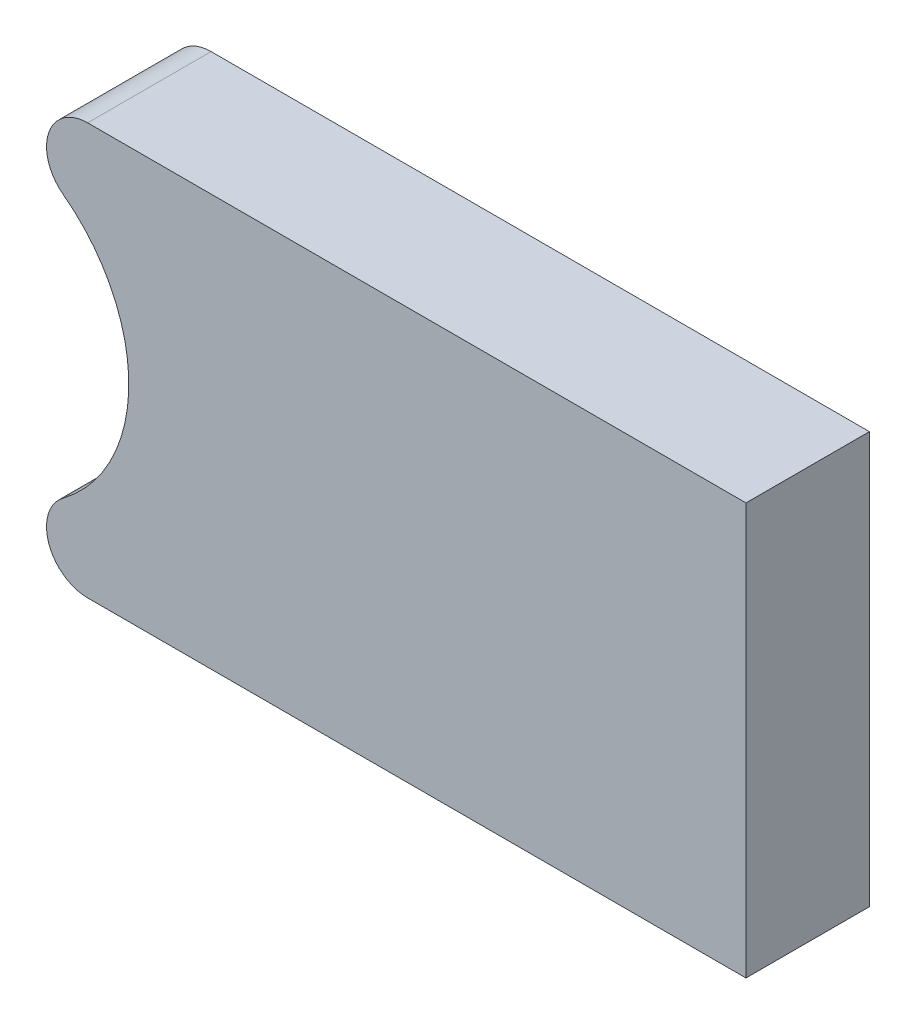
ISO-10303-21;
HEADER;
FILE_DESCRIPTION(('STEP AP214'),'2;1');
FILE_NAME('part.step','',(''),(''),'','','');
FILE_SCHEMA(('AUTOMOTIVE_DESIGN { 1 0 10303 214 1 1 1 1 }'));
ENDSEC;
DATA;
#1=APPLICATION_CONTEXT('core data for automotive mechanical design processes');
#2=APPLICATION_PROTOCOL_DEFINITION('international standard','automotive_design',2000,#1);
#3=PRODUCT_CONTEXT('',#1,'mechanical');
#4=PRODUCT('Part','Part','',(#3));
#5=PRODUCT_RELATED_PRODUCT_CATEGORY('part','',(#4));
#6=PRODUCT_DEFINITION_FORMATION('','',#4);
#7=PRODUCT_DEFINITION_CONTEXT('part definition',#1,'design');
#8=PRODUCT_DEFINITION('design','',#6,#7);
#9=PRODUCT_DEFINITION_SHAPE('','',#8);
#10=(LENGTH_UNIT() NAMED_UNIT(*) SI_UNIT(.MILLI.,.METRE.));
#11=(NAMED_UNIT(*) PLANE_ANGLE_UNIT() SI_UNIT($,.RADIAN.));
#12=(NAMED_UNIT(*) SI_UNIT($,.STERADIAN.) SOLID_ANGLE_UNIT());
#13=UNCERTAINTY_MEASURE_WITH_UNIT(LENGTH_MEASURE(1.E-05),#10,'distance_accuracy_value','');
#14=(GEOMETRIC_REPRESENTATION_CONTEXT(3) GLOBAL_UNCERTAINTY_ASSIGNED_CONTEXT((#13)) GLOBAL_UNIT_ASSIGNED_CONTEXT((#10,
#11,#12)) REPRESENTATION_CONTEXT('',''));
#15=CARTESIAN_POINT('',(0.,0.,0.));
#16=DIRECTION('',(0.,0.,1.));
#17=DIRECTION('',(1.,0.,0.));
#18=AXIS2_PLACEMENT_3D('',#15,#16,#17);
#19=CARTESIAN_POINT('',(0.,0.,0.));
#20=DIRECTION('',(0.,0.,1.));
#21=DIRECTION('',(1.,0.,0.));
#22=AXIS2_PLACEMENT_3D('',#19,#20,#21);
#23=PLANE('',#22);
#24=DIRECTION('',(0.,-1.,0.));
#25=VECTOR('',#24,1.);
#26=CARTESIAN_POINT('',(-60.325,19.05,0.));
#27=LINE('',#26,#25);
#28=CARTESIAN_POINT('',(-60.325,15.875,0.));
#29=VERTEX_POINT('',#28);
#30=CARTESIAN_POINT('',(-60.325,-15.875,0.));
#31=VERTEX_POINT('',#30);
#32=EDGE_CURVE('E129',#29,#31,#27,.T.);
#33=ORIENTED_EDGE('',*,*,#32,.F.);
#34=DIRECTION('',(-1.,0.,0.));
#35=VECTOR('',#34,1.);
#36=CARTESIAN_POINT('',(-111.125,15.875,0.));
#37=LINE('',#36,#35);
#38=CARTESIAN_POINT('',(-111.125,15.875,0.));
#39=VERTEX_POINT('',#38);
#40=EDGE_CURVE('E104',#29,#39,#37,.T.);
#41=ORIENTED_EDGE('',*,*,#40,.T.);
#42=CARTESIAN_POINT('',(-111.125,12.7,0.));
#43=DIRECTION('',(0.,0.,1.));
#44=DIRECTION('',(0.,-1.,0.));
#45=AXIS2_PLACEMENT_3D('',#42,#43,#44);
#46=CIRCLE('',#45,3.175);
#47=CARTESIAN_POINT('',(-113.03,10.16,0.));
#48=VERTEX_POINT('',#47);
#49=EDGE_CURVE('E113',#39,#48,#46,.T.);
#50=ORIENTED_EDGE('',*,*,#49,.T.);
#51=CARTESIAN_POINT('',(-120.65,0.,0.));
#52=DIRECTION('',(0.,0.,-1.));
#53=DIRECTION('',(0.,1.,0.));
#54=AXIS2_PLACEMENT_3D('',#51,#52,#53);
#55=CIRCLE('',#54,12.7);
#56=CARTESIAN_POINT('',(-113.03,-10.16,0.));
#57=VERTEX_POINT('',#56);
#58=EDGE_CURVE('E91',#48,#57,#55,.T.);
#59=ORIENTED_EDGE('',*,*,#58,.T.);
#60=CARTESIAN_POINT('',(-111.125,-12.7,0.));
#61=DIRECTION('',(0.,0.,1.));
#62=DIRECTION('',(0.,1.,0.));
#63=AXIS2_PLACEMENT_3D('',#60,#61,#62);
#64=CIRCLE('',#63,3.175);
#65=CARTESIAN_POINT('',(-111.125,-15.875,0.));
#66=VERTEX_POINT('',#65);
#67=EDGE_CURVE('E116',#57,#66,#64,.T.);
#68=ORIENTED_EDGE('',*,*,#67,.T.);
#69=DIRECTION('',(1.,0.,0.));
#70=VECTOR('',#69,1.);
#71=CARTESIAN_POINT('',(-9.52499999999993,-15.875,0.));
#72=LINE('',#71,#70);
#73=EDGE_CURVE('E119',#66,#31,#72,.T.);
#74=ORIENTED_EDGE('',*,*,#73,.T.);
#75=EDGE_LOOP('',(#33,#41,#50,#59,#68,#74));
#76=FACE_BOUND('',#75,.T.);
#77=ADVANCED_FACE('F33',(#76),#23,.T.);
#78=CARTESIAN_POINT('',(-60.325,19.05,-81.3322294290173));
#79=DIRECTION('',(-1.,0.,0.));
#80=DIRECTION('',(0.,-1.,0.));
#81=AXIS2_PLACEMENT_3D('',#78,#79,#80);
#82=PLANE('',#81);
#83=DIRECTION('',(0.,0.,-1.));
#84=VECTOR('',#83,1.);
#85=CARTESIAN_POINT('',(-60.325,15.875,-81.3322294290173));
#86=LINE('',#85,#84);
#87=CARTESIAN_POINT('',(-60.325,15.875,-9.525));
#88=VERTEX_POINT('',#87);
#89=EDGE_CURVE('E11',#29,#88,#86,.T.);
#90=ORIENTED_EDGE('',*,*,#89,.F.);
#91=ORIENTED_EDGE('',*,*,#32,.T.);
#92=DIRECTION('',(0.,0.,1.));
#93=VECTOR('',#92,1.);
#94=CARTESIAN_POINT('',(-60.325,-15.875,-81.3322294290173));
#95=LINE('',#94,#93);
#96=CARTESIAN_POINT('',(-60.325,-15.875,-9.52500000000001));
#97=VERTEX_POINT('',#96);
#98=EDGE_CURVE('E41',#97,#31,#95,.T.);
#99=ORIENTED_EDGE('',*,*,#98,.F.);
#100=DIRECTION('',(0.,-1.,0.));
#101=VECTOR('',#100,1.);
#102=CARTESIAN_POINT('',(-60.325,19.05,-9.52500000000001));
#103=LINE('',#102,#101);
#104=EDGE_CURVE('E125',#88,#97,#103,.T.);
#105=ORIENTED_EDGE('',*,*,#104,.F.);
#106=EDGE_LOOP('',(#90,#91,#99,#105));
#107=FACE_BOUND('',#106,.T.);
#108=ADVANCED_FACE('F140',(#107),#82,.F.);
#109=CARTESIAN_POINT('',(-111.125,12.7,-9.525));
#110=DIRECTION('',(0.,0.,-1.));
#111=DIRECTION('',(0.,-1.,0.));
#112=AXIS2_PLACEMENT_3D('',#109,#110,#111);
#113=PLANE('',#112);
#114=CARTESIAN_POINT('',(-111.125,12.7,-9.525));
#115=DIRECTION('',(0.,0.,1.));
#116=DIRECTION('',(0.,-1.,0.));
#117=AXIS2_PLACEMENT_3D('',#114,#115,#116);
#118=CIRCLE('',#117,3.175);
#119=CARTESIAN_POINT('',(-111.125,15.875,-9.525));
#120=VERTEX_POINT('',#119);
#121=CARTESIAN_POINT('',(-113.03,10.16,-9.525));
#122=VERTEX_POINT('',#121);
#123=EDGE_CURVE('E100',#120,#122,#118,.T.);
#124=ORIENTED_EDGE('',*,*,#123,.F.);
#125=DIRECTION('',(-1.,0.,0.));
#126=VECTOR('',#125,1.);
#127=CARTESIAN_POINT('',(-111.125,15.875,-9.525));
#128=LINE('',#127,#126);
#129=EDGE_CURVE('E96',#88,#120,#128,.T.);
#130=ORIENTED_EDGE('',*,*,#129,.F.);
#131=ORIENTED_EDGE('',*,*,#104,.T.);
#132=DIRECTION('',(1.,0.,0.));
#133=VECTOR('',#132,1.);
#134=CARTESIAN_POINT('',(-9.52499999999993,-15.875,-9.525));
#135=LINE('',#134,#133);
#136=CARTESIAN_POINT('',(-111.125,-15.875,-9.525));
#137=VERTEX_POINT('',#136);
#138=EDGE_CURVE('E48',#137,#97,#135,.T.);
#139=ORIENTED_EDGE('',*,*,#138,.F.);
#140=CARTESIAN_POINT('',(-111.125,-12.7,-9.525));
#141=DIRECTION('',(0.,0.,1.));
#142=DIRECTION('',(0.,1.,0.));
#143=AXIS2_PLACEMENT_3D('',#140,#141,#142);
#144=CIRCLE('',#143,3.175);
#145=CARTESIAN_POINT('',(-113.03,-10.16,-9.525));
#146=VERTEX_POINT('',#145);
#147=EDGE_CURVE('E107',#146,#137,#144,.T.);
#148=ORIENTED_EDGE('',*,*,#147,.F.);
#149=CARTESIAN_POINT('',(-120.65,0.,-9.525));
#150=DIRECTION('',(0.,0.,-1.));
#151=DIRECTION('',(0.,1.,0.));
#152=AXIS2_PLACEMENT_3D('',#149,#150,#151);
#153=CIRCLE('',#152,12.7);
#154=EDGE_CURVE('E88',#122,#146,#153,.T.);
#155=ORIENTED_EDGE('',*,*,#154,.F.);
#156=EDGE_LOOP('',(#124,#130,#131,#139,#148,#155));
#157=FACE_BOUND('',#156,.T.);
#158=ADVANCED_FACE('F35',(#157),#113,.T.);
#159=CARTESIAN_POINT('',(-111.125,15.875,-9.525));
#160=DIRECTION('',(0.,1.,0.));
#161=DIRECTION('',(1.,0.,0.));
#162=AXIS2_PLACEMENT_3D('',#159,#160,#161);
#163=PLANE('',#162);
#164=ORIENTED_EDGE('',*,*,#89,.T.);
#165=ORIENTED_EDGE('',*,*,#129,.T.);
#166=DIRECTION('',(0.,0.,1.));
#167=VECTOR('',#166,1.);
#168=CARTESIAN_POINT('',(-111.125,15.875,-9.525));
#169=LINE('',#168,#167);
#170=EDGE_CURVE('E102',#120,#39,#169,.T.);
#171=ORIENTED_EDGE('',*,*,#170,.T.);
#172=ORIENTED_EDGE('',*,*,#40,.F.);
#173=EDGE_LOOP('',(#164,#165,#171,#172));
#174=FACE_BOUND('',#173,.T.);
#175=ADVANCED_FACE('F141',(#174),#163,.T.);
#176=CARTESIAN_POINT('',(-9.52499999999993,-15.875,-9.525));
#177=DIRECTION('',(0.,-1.,0.));
#178=DIRECTION('',(-1.,0.,0.));
#179=AXIS2_PLACEMENT_3D('',#176,#177,#178);
#180=PLANE('',#179);
#181=ORIENTED_EDGE('',*,*,#98,.T.);
#182=ORIENTED_EDGE('',*,*,#73,.F.);
#183=DIRECTION('',(0.,0.,1.));
#184=VECTOR('',#183,1.);
#185=CARTESIAN_POINT('',(-111.125,-15.875,-9.525));
#186=LINE('',#185,#184);
#187=EDGE_CURVE('E126',#137,#66,#186,.T.);
#188=ORIENTED_EDGE('',*,*,#187,.F.);
#189=ORIENTED_EDGE('',*,*,#138,.T.);
#190=EDGE_LOOP('',(#181,#182,#188,#189));
#191=FACE_BOUND('',#190,.T.);
#192=ADVANCED_FACE('F134',(#191),#180,.T.);
#193=CARTESIAN_POINT('',(-111.125,12.7,-9.525));
#194=DIRECTION('',(0.,0.,1.));
#195=DIRECTION('',(0.,1.,0.));
#196=AXIS2_PLACEMENT_3D('',#193,#194,#195);
#197=CYLINDRICAL_SURFACE('',#196,3.175);
#198=ORIENTED_EDGE('',*,*,#49,.F.);
#199=ORIENTED_EDGE('',*,*,#170,.F.);
#200=ORIENTED_EDGE('',*,*,#123,.T.);
#201=DIRECTION('',(0.,0.,1.));
#202=VECTOR('',#201,1.);
#203=CARTESIAN_POINT('',(-113.03,10.16,-9.525));
#204=LINE('',#203,#202);
#205=EDGE_CURVE('E84',#122,#48,#204,.T.);
#206=ORIENTED_EDGE('',*,*,#205,.T.);
#207=EDGE_LOOP('',(#198,#199,#200,#206));
#208=FACE_BOUND('',#207,.T.);
#209=ADVANCED_FACE('F101',(#208),#197,.T.);
#210=CARTESIAN_POINT('',(-111.125,-12.7,-9.525));
#211=DIRECTION('',(0.,0.,1.));
#212=DIRECTION('',(0.,1.,0.));
#213=AXIS2_PLACEMENT_3D('',#210,#211,#212);
#214=CYLINDRICAL_SURFACE('',#213,3.175);
#215=ORIENTED_EDGE('',*,*,#67,.F.);
#216=DIRECTION('',(0.,0.,1.));
#217=VECTOR('',#216,1.);
#218=CARTESIAN_POINT('',(-113.03,-10.16,-9.525));
#219=LINE('',#218,#217);
#220=EDGE_CURVE('E95',#146,#57,#219,.T.);
#221=ORIENTED_EDGE('',*,*,#220,.F.);
#222=ORIENTED_EDGE('',*,*,#147,.T.);
#223=ORIENTED_EDGE('',*,*,#187,.T.);
#224=EDGE_LOOP('',(#215,#221,#222,#223));
#225=FACE_BOUND('',#224,.T.);
#226=ADVANCED_FACE('F157',(#225),#214,.T.);
#227=CARTESIAN_POINT('',(-120.65,0.,-9.525));
#228=DIRECTION('',(0.,0.,1.));
#229=DIRECTION('',(0.,1.,0.));
#230=AXIS2_PLACEMENT_3D('',#227,#228,#229);
#231=CYLINDRICAL_SURFACE('',#230,12.7);
#232=ORIENTED_EDGE('',*,*,#58,.F.);
#233=ORIENTED_EDGE('',*,*,#205,.F.);
#234=ORIENTED_EDGE('',*,*,#154,.T.);
#235=ORIENTED_EDGE('',*,*,#220,.T.);
#236=EDGE_LOOP('',(#232,#233,#234,#235));
#237=FACE_BOUND('',#236,.T.);
#238=ADVANCED_FACE('F86',(#237),#231,.F.);
#239=CLOSED_SHELL('',(#77,#108,#158,#175,#192,#209,#226,#238));
#240=MANIFOLD_SOLID_BREP('B2',#239);
#241=ADVANCED_BREP_SHAPE_REPRESENTATION('',(#18,#240),#14);
#242=SHAPE_DEFINITION_REPRESENTATION(#9,#241);
ENDSEC;
END-ISO-10303-21;
